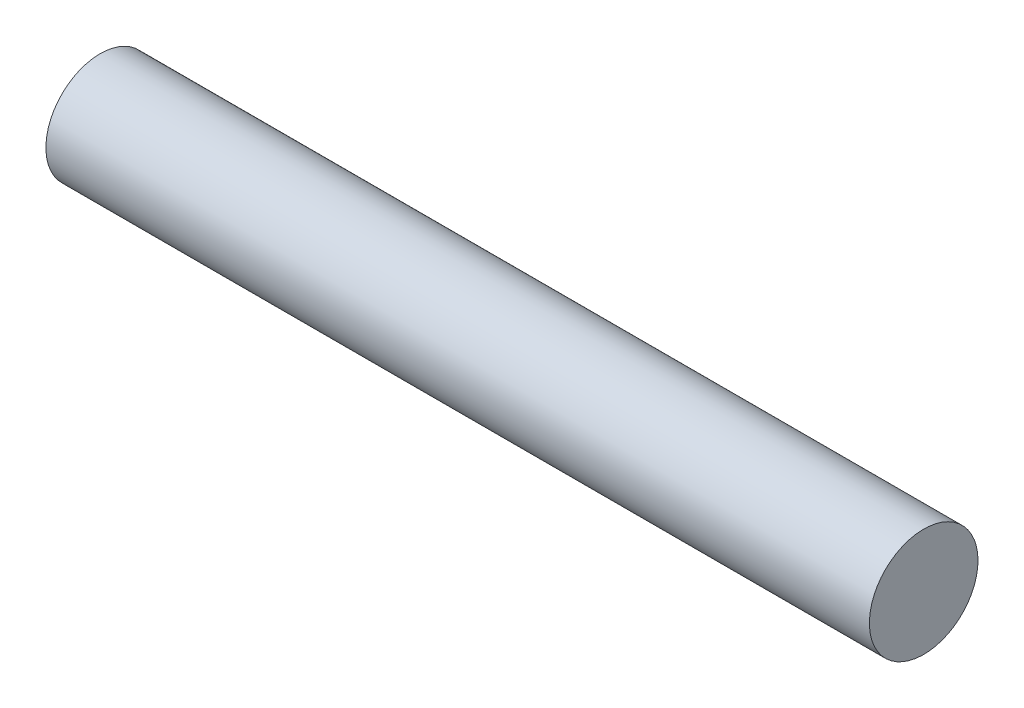
ISO-10303-21;
HEADER;
FILE_DESCRIPTION(('STEP AP214'),'2;1');
FILE_NAME('part.step','',(''),(''),'','','');
FILE_SCHEMA(('AUTOMOTIVE_DESIGN { 1 0 10303 214 1 1 1 1 }'));
ENDSEC;
DATA;
#1=APPLICATION_CONTEXT('core data for automotive mechanical design processes');
#2=APPLICATION_PROTOCOL_DEFINITION('international standard','automotive_design',2000,#1);
#3=PRODUCT_CONTEXT('',#1,'mechanical');
#4=PRODUCT('Part','Part','',(#3));
#5=PRODUCT_RELATED_PRODUCT_CATEGORY('part','',(#4));
#6=PRODUCT_DEFINITION_FORMATION('','',#4);
#7=PRODUCT_DEFINITION_CONTEXT('part definition',#1,'design');
#8=PRODUCT_DEFINITION('design','',#6,#7);
#9=PRODUCT_DEFINITION_SHAPE('','',#8);
#10=(LENGTH_UNIT() NAMED_UNIT(*) SI_UNIT(.MILLI.,.METRE.));
#11=(NAMED_UNIT(*) PLANE_ANGLE_UNIT() SI_UNIT($,.RADIAN.));
#12=(NAMED_UNIT(*) SI_UNIT($,.STERADIAN.) SOLID_ANGLE_UNIT());
#13=UNCERTAINTY_MEASURE_WITH_UNIT(LENGTH_MEASURE(1.E-05),#10,'distance_accuracy_value','');
#14=(GEOMETRIC_REPRESENTATION_CONTEXT(3) GLOBAL_UNCERTAINTY_ASSIGNED_CONTEXT((#13)) GLOBAL_UNIT_ASSIGNED_CONTEXT((#10,
#11,#12)) REPRESENTATION_CONTEXT('',''));
#15=CARTESIAN_POINT('',(0.,0.,0.));
#16=DIRECTION('',(0.,0.,1.));
#17=DIRECTION('',(1.,0.,0.));
#18=AXIS2_PLACEMENT_3D('',#15,#16,#17);
#19=CARTESIAN_POINT('',(91.,0.,0.));
#20=DIRECTION('',(-1.,0.,0.));
#21=DIRECTION('',(0.,0.,1.));
#22=AXIS2_PLACEMENT_3D('',#19,#20,#21);
#23=CYLINDRICAL_SURFACE('',#22,6.);
#24=CARTESIAN_POINT('',(91.,0.,0.));
#25=DIRECTION('',(1.,0.,0.));
#26=DIRECTION('',(0.,0.,-1.));
#27=AXIS2_PLACEMENT_3D('',#24,#25,#26);
#28=CIRCLE('',#27,6.);
#29=CARTESIAN_POINT('',(91.,0.,-6.));
#30=VERTEX_POINT('',#29);
#31=EDGE_CURVE('E10',#30,#30,#28,.T.);
#32=ORIENTED_EDGE('',*,*,#31,.F.);
#33=EDGE_LOOP('',(#32));
#34=FACE_BOUND('',#33,.T.);
#35=CARTESIAN_POINT('',(0.,0.,0.));
#36=DIRECTION('',(1.,0.,0.));
#37=DIRECTION('',(0.,0.,-1.));
#38=AXIS2_PLACEMENT_3D('',#35,#36,#37);
#39=CIRCLE('',#38,6.);
#40=CARTESIAN_POINT('',(0.,0.,-6.));
#41=VERTEX_POINT('',#40);
#42=EDGE_CURVE('E38',#41,#41,#39,.T.);
#43=ORIENTED_EDGE('',*,*,#42,.T.);
#44=EDGE_LOOP('',(#43));
#45=FACE_BOUND('',#44,.T.);
#46=ADVANCED_FACE('F35',(#34,#45),#23,.T.);
#47=CARTESIAN_POINT('',(91.,0.,0.));
#48=DIRECTION('',(1.,0.,0.));
#49=DIRECTION('',(0.,0.,-1.));
#50=AXIS2_PLACEMENT_3D('',#47,#48,#49);
#51=PLANE('',#50);
#52=ORIENTED_EDGE('',*,*,#31,.T.);
#53=EDGE_LOOP('',(#52));
#54=FACE_BOUND('',#53,.T.);
#55=ADVANCED_FACE('F50',(#54),#51,.T.);
#56=CARTESIAN_POINT('',(0.,0.,0.));
#57=DIRECTION('',(1.,0.,0.));
#58=DIRECTION('',(0.,0.,-1.));
#59=AXIS2_PLACEMENT_3D('',#56,#57,#58);
#60=PLANE('',#59);
#61=ORIENTED_EDGE('',*,*,#42,.F.);
#62=EDGE_LOOP('',(#61));
#63=FACE_BOUND('',#62,.T.);
#64=ADVANCED_FACE('F48',(#63),#60,.F.);
#65=CLOSED_SHELL('',(#46,#55,#64));
#66=MANIFOLD_SOLID_BREP('B2',#65);
#67=ADVANCED_BREP_SHAPE_REPRESENTATION('',(#18,#66),#14);
#68=SHAPE_DEFINITION_REPRESENTATION(#9,#67);
ENDSEC;
END-ISO-10303-21;
